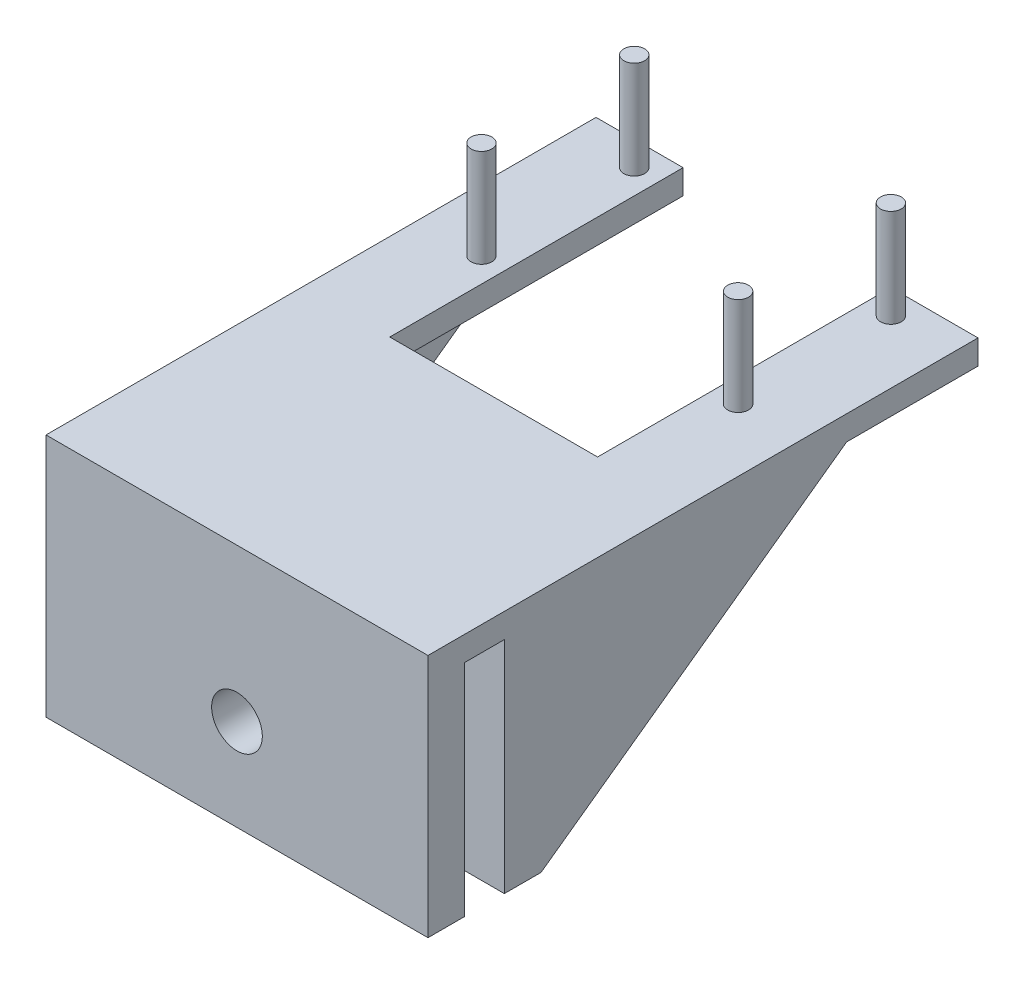
ISO-10303-21;
HEADER;
FILE_DESCRIPTION(('STEP AP214'),'2;1');
FILE_NAME('part.step','',(''),(''),'','','');
FILE_SCHEMA(('AUTOMOTIVE_DESIGN { 1 0 10303 214 1 1 1 1 }'));
ENDSEC;
DATA;
#1=APPLICATION_CONTEXT('core data for automotive mechanical design processes');
#2=APPLICATION_PROTOCOL_DEFINITION('international standard','automotive_design',2000,#1);
#3=PRODUCT_CONTEXT('',#1,'mechanical');
#4=PRODUCT('Part','Part','',(#3));
#5=PRODUCT_RELATED_PRODUCT_CATEGORY('part','',(#4));
#6=PRODUCT_DEFINITION_FORMATION('','',#4);
#7=PRODUCT_DEFINITION_CONTEXT('part definition',#1,'design');
#8=PRODUCT_DEFINITION('design','',#6,#7);
#9=PRODUCT_DEFINITION_SHAPE('','',#8);
#10=(LENGTH_UNIT() NAMED_UNIT(*) SI_UNIT(.MILLI.,.METRE.));
#11=(NAMED_UNIT(*) PLANE_ANGLE_UNIT() SI_UNIT($,.RADIAN.));
#12=(NAMED_UNIT(*) SI_UNIT($,.STERADIAN.) SOLID_ANGLE_UNIT());
#13=UNCERTAINTY_MEASURE_WITH_UNIT(LENGTH_MEASURE(1.E-05),#10,'distance_accuracy_value','');
#14=(GEOMETRIC_REPRESENTATION_CONTEXT(3) GLOBAL_UNCERTAINTY_ASSIGNED_CONTEXT((#13)) GLOBAL_UNIT_ASSIGNED_CONTEXT((#10,
#11,#12)) REPRESENTATION_CONTEXT('',''));
#15=CARTESIAN_POINT('',(0.,0.,0.));
#16=DIRECTION('',(0.,0.,1.));
#17=DIRECTION('',(1.,0.,0.));
#18=AXIS2_PLACEMENT_3D('',#15,#16,#17);
#19=CARTESIAN_POINT('',(31.25,-18.,-9.24999999999999));
#20=DIRECTION('',(0.,0.,1.));
#21=DIRECTION('',(1.,0.,0.));
#22=AXIS2_PLACEMENT_3D('',#19,#20,#21);
#23=PLANE('',#22);
#24=CARTESIAN_POINT('',(15.625,-10.5,-9.24999999999999));
#25=DIRECTION('',(0.,0.,1.));
#26=DIRECTION('',(1.,0.,0.));
#27=AXIS2_PLACEMENT_3D('',#24,#25,#26);
#28=CIRCLE('',#27,2.07500000000001);
#29=CARTESIAN_POINT('',(17.7,-10.5,-9.24999999999999));
#30=VERTEX_POINT('',#29);
#31=EDGE_CURVE('E194',#30,#30,#28,.T.);
#32=ORIENTED_EDGE('',*,*,#31,.T.);
#33=EDGE_LOOP('',(#32));
#34=FACE_BOUND('',#33,.T.);
#35=DIRECTION('',(0.,1.,0.));
#36=VECTOR('',#35,1.);
#37=CARTESIAN_POINT('',(27.25,-18.,-9.24999999999999));
#38=LINE('',#37,#36);
#39=CARTESIAN_POINT('',(27.25,-18.,-9.25));
#40=VERTEX_POINT('',#39);
#41=CARTESIAN_POINT('',(27.25,0.,-9.24999999999999));
#42=VERTEX_POINT('',#41);
#43=EDGE_CURVE('E159',#40,#42,#38,.T.);
#44=ORIENTED_EDGE('',*,*,#43,.F.);
#45=DIRECTION('',(1.,0.,0.));
#46=VECTOR('',#45,1.);
#47=CARTESIAN_POINT('',(31.25,-18.,-9.24999999999999));
#48=LINE('',#47,#46);
#49=CARTESIAN_POINT('',(4.,-18.,-9.25));
#50=VERTEX_POINT('',#49);
#51=EDGE_CURVE('E209',#50,#40,#48,.T.);
#52=ORIENTED_EDGE('',*,*,#51,.F.);
#53=DIRECTION('',(0.,1.,0.));
#54=VECTOR('',#53,1.);
#55=CARTESIAN_POINT('',(4.,-18.,-9.25));
#56=LINE('',#55,#54);
#57=CARTESIAN_POINT('',(4.,0.,-9.25));
#58=VERTEX_POINT('',#57);
#59=EDGE_CURVE('E183',#50,#58,#56,.T.);
#60=ORIENTED_EDGE('',*,*,#59,.T.);
#61=DIRECTION('',(1.,0.,0.));
#62=VECTOR('',#61,1.);
#63=CARTESIAN_POINT('',(31.25,0.,-9.24999999999999));
#64=LINE('',#63,#62);
#65=EDGE_CURVE('E200',#58,#42,#64,.T.);
#66=ORIENTED_EDGE('',*,*,#65,.T.);
#67=EDGE_LOOP('',(#44,#52,#60,#66));
#68=FACE_BOUND('',#67,.T.);
#69=ADVANCED_FACE('F33',(#34,#68),#23,.F.);
#70=CARTESIAN_POINT('',(0.,0.,0.));
#71=DIRECTION('',(0.,-1.,0.));
#72=DIRECTION('',(0.,0.,-1.));
#73=AXIS2_PLACEMENT_3D('',#70,#71,#72);
#74=PLANE('',#73);
#75=DIRECTION('',(-1.,0.,0.));
#76=VECTOR('',#75,1.);
#77=CARTESIAN_POINT('',(0.,0.,-34.25));
#78=LINE('',#77,#76);
#79=CARTESIAN_POINT('',(27.25,0.,-34.25));
#80=VERTEX_POINT('',#79);
#81=CARTESIAN_POINT('',(31.25,0.,-34.25));
#82=VERTEX_POINT('',#81);
#83=EDGE_CURVE('E164',#80,#82,#78,.F.);
#84=ORIENTED_EDGE('',*,*,#83,.F.);
#85=DIRECTION('',(0.,0.,1.));
#86=VECTOR('',#85,1.);
#87=CARTESIAN_POINT('',(27.25,0.,0.));
#88=LINE('',#87,#86);
#89=EDGE_CURVE('E154',#80,#42,#88,.T.);
#90=ORIENTED_EDGE('',*,*,#89,.T.);
#91=ORIENTED_EDGE('',*,*,#65,.F.);
#92=DIRECTION('',(0.,0.,1.));
#93=VECTOR('',#92,1.);
#94=CARTESIAN_POINT('',(4.,0.,0.));
#95=LINE('',#94,#93);
#96=CARTESIAN_POINT('',(4.,0.,-34.25));
#97=VERTEX_POINT('',#96);
#98=EDGE_CURVE('E187',#97,#58,#95,.T.);
#99=ORIENTED_EDGE('',*,*,#98,.F.);
#100=DIRECTION('',(-1.,0.,0.));
#101=VECTOR('',#100,1.);
#102=CARTESIAN_POINT('',(0.,0.,-34.25));
#103=LINE('',#102,#101);
#104=CARTESIAN_POINT('',(0.,0.,-34.25));
#105=VERTEX_POINT('',#104);
#106=EDGE_CURVE('E189',#105,#97,#103,.F.);
#107=ORIENTED_EDGE('',*,*,#106,.F.);
#108=DIRECTION('',(0.,0.,1.));
#109=VECTOR('',#108,1.);
#110=CARTESIAN_POINT('',(0.,0.,0.));
#111=LINE('',#110,#109);
#112=CARTESIAN_POINT('',(0.,0.,-45.));
#113=VERTEX_POINT('',#112);
#114=EDGE_CURVE('E252',#113,#105,#111,.T.);
#115=ORIENTED_EDGE('',*,*,#114,.F.);
#116=DIRECTION('',(-1.,0.,0.));
#117=VECTOR('',#116,1.);
#118=CARTESIAN_POINT('',(0.,0.,-45.));
#119=LINE('',#118,#117);
#120=CARTESIAN_POINT('',(7.125,0.,-45.));
#121=VERTEX_POINT('',#120);
#122=EDGE_CURVE('E278',#121,#113,#119,.T.);
#123=ORIENTED_EDGE('',*,*,#122,.F.);
#124=DIRECTION('',(0.,0.,-1.));
#125=VECTOR('',#124,1.);
#126=CARTESIAN_POINT('',(7.125,0.,-45.));
#127=LINE('',#126,#125);
#128=CARTESIAN_POINT('',(7.125,0.,-21.));
#129=VERTEX_POINT('',#128);
#130=EDGE_CURVE('E276',#129,#121,#127,.T.);
#131=ORIENTED_EDGE('',*,*,#130,.F.);
#132=DIRECTION('',(-1.,0.,0.));
#133=VECTOR('',#132,1.);
#134=CARTESIAN_POINT('',(7.125,0.,-21.));
#135=LINE('',#134,#133);
#136=CARTESIAN_POINT('',(24.125,0.,-21.));
#137=VERTEX_POINT('',#136);
#138=EDGE_CURVE('E274',#137,#129,#135,.T.);
#139=ORIENTED_EDGE('',*,*,#138,.F.);
#140=DIRECTION('',(0.,0.,1.));
#141=VECTOR('',#140,1.);
#142=CARTESIAN_POINT('',(24.125,0.,-21.));
#143=LINE('',#142,#141);
#144=CARTESIAN_POINT('',(24.125,0.,-45.));
#145=VERTEX_POINT('',#144);
#146=EDGE_CURVE('E272',#145,#137,#143,.T.);
#147=ORIENTED_EDGE('',*,*,#146,.F.);
#148=DIRECTION('',(-1.,0.,0.));
#149=VECTOR('',#148,1.);
#150=CARTESIAN_POINT('',(24.125,0.,-45.));
#151=LINE('',#150,#149);
#152=CARTESIAN_POINT('',(31.25,0.,-45.));
#153=VERTEX_POINT('',#152);
#154=EDGE_CURVE('E270',#153,#145,#151,.T.);
#155=ORIENTED_EDGE('',*,*,#154,.F.);
#156=DIRECTION('',(0.,0.,-1.));
#157=VECTOR('',#156,1.);
#158=CARTESIAN_POINT('',(31.25,0.,-45.));
#159=LINE('',#158,#157);
#160=EDGE_CURVE('E176',#82,#153,#159,.T.);
#161=ORIENTED_EDGE('',*,*,#160,.F.);
#162=EDGE_LOOP('',(#84,#90,#91,#99,#107,#115,#123,#131,#139,#147,#155,#161));
#163=FACE_BOUND('',#162,.T.);
#164=ADVANCED_FACE('F174',(#163),#74,.T.);
#165=CARTESIAN_POINT('',(31.25,0.,-3.));
#166=VERTEX_POINT('',#165);
#167=CARTESIAN_POINT('',(31.25,0.,-6.25000000000001));
#168=VERTEX_POINT('',#167);
#169=EDGE_CURVE('E267',#166,#168,#159,.T.);
#170=ORIENTED_EDGE('',*,*,#169,.F.);
#171=DIRECTION('',(1.,0.,0.));
#172=VECTOR('',#171,1.);
#173=CARTESIAN_POINT('',(31.25,0.,-3.));
#174=LINE('',#173,#172);
#175=CARTESIAN_POINT('',(0.,0.,-3.));
#176=VERTEX_POINT('',#175);
#177=EDGE_CURVE('E219',#176,#166,#174,.T.);
#178=ORIENTED_EDGE('',*,*,#177,.F.);
#179=CARTESIAN_POINT('',(0.,0.,-6.25));
#180=VERTEX_POINT('',#179);
#181=EDGE_CURVE('E280',#180,#176,#111,.T.);
#182=ORIENTED_EDGE('',*,*,#181,.F.);
#183=DIRECTION('',(-1.,0.,0.));
#184=VECTOR('',#183,1.);
#185=CARTESIAN_POINT('',(0.,0.,-6.25));
#186=LINE('',#185,#184);
#187=EDGE_CURVE('E204',#168,#180,#186,.T.);
#188=ORIENTED_EDGE('',*,*,#187,.F.);
#189=EDGE_LOOP('',(#170,#178,#182,#188));
#190=FACE_BOUND('',#189,.T.);
#191=ADVANCED_FACE('F344',(#190),#74,.T.);
#192=CARTESIAN_POINT('',(31.25,2.,0.));
#193=DIRECTION('',(0.,0.,-1.));
#194=DIRECTION('',(-1.,0.,0.));
#195=AXIS2_PLACEMENT_3D('',#192,#193,#194);
#196=PLANE('',#195);
#197=DIRECTION('',(0.,-1.,0.));
#198=VECTOR('',#197,1.);
#199=CARTESIAN_POINT('',(31.25,2.,0.));
#200=LINE('',#199,#198);
#201=CARTESIAN_POINT('',(31.25,2.,0.));
#202=VERTEX_POINT('',#201);
#203=CARTESIAN_POINT('',(31.25,-18.,0.));
#204=VERTEX_POINT('',#203);
#205=EDGE_CURVE('E303',#202,#204,#200,.T.);
#206=ORIENTED_EDGE('',*,*,#205,.F.);
#207=DIRECTION('',(1.,0.,0.));
#208=VECTOR('',#207,1.);
#209=CARTESIAN_POINT('',(31.25,2.,0.));
#210=LINE('',#209,#208);
#211=CARTESIAN_POINT('',(0.,2.,0.));
#212=VERTEX_POINT('',#211);
#213=EDGE_CURVE('E249',#212,#202,#210,.T.);
#214=ORIENTED_EDGE('',*,*,#213,.F.);
#215=DIRECTION('',(0.,-1.,0.));
#216=VECTOR('',#215,1.);
#217=CARTESIAN_POINT('',(0.,2.,0.));
#218=LINE('',#217,#216);
#219=CARTESIAN_POINT('',(0.,-18.,0.));
#220=VERTEX_POINT('',#219);
#221=EDGE_CURVE('E266',#212,#220,#218,.T.);
#222=ORIENTED_EDGE('',*,*,#221,.T.);
#223=DIRECTION('',(-1.,0.,0.));
#224=VECTOR('',#223,1.);
#225=CARTESIAN_POINT('',(0.,-18.,0.));
#226=LINE('',#225,#224);
#227=EDGE_CURVE('E228',#204,#220,#226,.T.);
#228=ORIENTED_EDGE('',*,*,#227,.F.);
#229=EDGE_LOOP('',(#206,#214,#222,#228));
#230=FACE_BOUND('',#229,.T.);
#231=CARTESIAN_POINT('',(15.625,-10.5,0.));
#232=DIRECTION('',(0.,0.,1.));
#233=DIRECTION('',(1.,0.,0.));
#234=AXIS2_PLACEMENT_3D('',#231,#232,#233);
#235=CIRCLE('',#234,2.07500000000001);
#236=CARTESIAN_POINT('',(17.7,-10.5,0.));
#237=VERTEX_POINT('',#236);
#238=EDGE_CURVE('E191',#237,#237,#235,.T.);
#239=ORIENTED_EDGE('',*,*,#238,.F.);
#240=EDGE_LOOP('',(#239));
#241=FACE_BOUND('',#240,.T.);
#242=ADVANCED_FACE('F35',(#230,#241),#196,.F.);
#243=CARTESIAN_POINT('',(31.25,2.,-45.));
#244=DIRECTION('',(-1.,0.,0.));
#245=DIRECTION('',(0.,0.,1.));
#246=AXIS2_PLACEMENT_3D('',#243,#244,#245);
#247=PLANE('',#246);
#248=DIRECTION('',(0.,-0.584304725845076,0.811534341451494));
#249=VECTOR('',#248,1.);
#250=CARTESIAN_POINT('',(31.25,0.,-34.25));
#251=LINE('',#250,#249);
#252=CARTESIAN_POINT('',(31.25,-18.,-9.24999999999999));
#253=VERTEX_POINT('',#252);
#254=EDGE_CURVE('E171',#82,#253,#251,.T.);
#255=ORIENTED_EDGE('',*,*,#254,.F.);
#256=ORIENTED_EDGE('',*,*,#160,.T.);
#257=DIRECTION('',(0.,-1.,0.));
#258=VECTOR('',#257,1.);
#259=CARTESIAN_POINT('',(31.25,2.,-45.));
#260=LINE('',#259,#258);
#261=CARTESIAN_POINT('',(31.25,2.,-45.));
#262=VERTEX_POINT('',#261);
#263=EDGE_CURVE('E300',#262,#153,#260,.T.);
#264=ORIENTED_EDGE('',*,*,#263,.F.);
#265=DIRECTION('',(0.,0.,-1.));
#266=VECTOR('',#265,1.);
#267=CARTESIAN_POINT('',(31.25,2.,-45.));
#268=LINE('',#267,#266);
#269=EDGE_CURVE('E251',#202,#262,#268,.T.);
#270=ORIENTED_EDGE('',*,*,#269,.F.);
#271=ORIENTED_EDGE('',*,*,#205,.T.);
#272=DIRECTION('',(0.,0.,1.));
#273=VECTOR('',#272,1.);
#274=CARTESIAN_POINT('',(31.25,-18.,0.));
#275=LINE('',#274,#273);
#276=CARTESIAN_POINT('',(31.25,-18.,-3.));
#277=VERTEX_POINT('',#276);
#278=EDGE_CURVE('E225',#277,#204,#275,.T.);
#279=ORIENTED_EDGE('',*,*,#278,.F.);
#280=DIRECTION('',(0.,1.,0.));
#281=VECTOR('',#280,1.);
#282=CARTESIAN_POINT('',(31.25,-18.,-3.));
#283=LINE('',#282,#281);
#284=EDGE_CURVE('E230',#277,#166,#283,.T.);
#285=ORIENTED_EDGE('',*,*,#284,.T.);
#286=ORIENTED_EDGE('',*,*,#169,.T.);
#287=DIRECTION('',(0.,1.,0.));
#288=VECTOR('',#287,1.);
#289=CARTESIAN_POINT('',(31.25,-18.,-6.25));
#290=LINE('',#289,#288);
#291=CARTESIAN_POINT('',(31.25,-18.,-6.25));
#292=VERTEX_POINT('',#291);
#293=EDGE_CURVE('E57',#292,#168,#290,.T.);
#294=ORIENTED_EDGE('',*,*,#293,.F.);
#295=DIRECTION('',(0.,0.,1.));
#296=VECTOR('',#295,1.);
#297=CARTESIAN_POINT('',(31.25,-18.,-6.25));
#298=LINE('',#297,#296);
#299=EDGE_CURVE('E208',#253,#292,#298,.T.);
#300=ORIENTED_EDGE('',*,*,#299,.F.);
#301=EDGE_LOOP('',(#255,#256,#264,#270,#271,#279,#285,#286,#294,#300));
#302=FACE_BOUND('',#301,.T.);
#303=ADVANCED_FACE('F477',(#302),#247,.F.);
#304=CARTESIAN_POINT('',(24.125,2.,-45.));
#305=DIRECTION('',(0.,0.,1.));
#306=DIRECTION('',(1.,0.,0.));
#307=AXIS2_PLACEMENT_3D('',#304,#305,#306);
#308=PLANE('',#307);
#309=ORIENTED_EDGE('',*,*,#154,.T.);
#310=DIRECTION('',(0.,-1.,0.));
#311=VECTOR('',#310,1.);
#312=CARTESIAN_POINT('',(24.125,2.,-45.));
#313=LINE('',#312,#311);
#314=CARTESIAN_POINT('',(24.125,2.,-45.));
#315=VERTEX_POINT('',#314);
#316=EDGE_CURVE('E297',#315,#145,#313,.T.);
#317=ORIENTED_EDGE('',*,*,#316,.F.);
#318=DIRECTION('',(-1.,0.,0.));
#319=VECTOR('',#318,1.);
#320=CARTESIAN_POINT('',(24.125,2.,-45.));
#321=LINE('',#320,#319);
#322=EDGE_CURVE('E254',#262,#315,#321,.T.);
#323=ORIENTED_EDGE('',*,*,#322,.F.);
#324=ORIENTED_EDGE('',*,*,#263,.T.);
#325=EDGE_LOOP('',(#309,#317,#323,#324));
#326=FACE_BOUND('',#325,.T.);
#327=ADVANCED_FACE('F484',(#326),#308,.F.);
#328=CARTESIAN_POINT('',(24.125,2.,-21.));
#329=DIRECTION('',(1.,0.,0.));
#330=DIRECTION('',(0.,0.,-1.));
#331=AXIS2_PLACEMENT_3D('',#328,#329,#330);
#332=PLANE('',#331);
#333=ORIENTED_EDGE('',*,*,#146,.T.);
#334=DIRECTION('',(0.,-1.,0.));
#335=VECTOR('',#334,1.);
#336=CARTESIAN_POINT('',(24.125,2.,-21.));
#337=LINE('',#336,#335);
#338=CARTESIAN_POINT('',(24.125,2.,-21.));
#339=VERTEX_POINT('',#338);
#340=EDGE_CURVE('E294',#339,#137,#337,.T.);
#341=ORIENTED_EDGE('',*,*,#340,.F.);
#342=DIRECTION('',(0.,0.,1.));
#343=VECTOR('',#342,1.);
#344=CARTESIAN_POINT('',(24.125,2.,-21.));
#345=LINE('',#344,#343);
#346=EDGE_CURVE('E256',#315,#339,#345,.T.);
#347=ORIENTED_EDGE('',*,*,#346,.F.);
#348=ORIENTED_EDGE('',*,*,#316,.T.);
#349=EDGE_LOOP('',(#333,#341,#347,#348));
#350=FACE_BOUND('',#349,.T.);
#351=ADVANCED_FACE('F588',(#350),#332,.F.);
#352=CARTESIAN_POINT('',(7.125,2.,-21.));
#353=DIRECTION('',(0.,0.,1.));
#354=DIRECTION('',(1.,0.,0.));
#355=AXIS2_PLACEMENT_3D('',#352,#353,#354);
#356=PLANE('',#355);
#357=ORIENTED_EDGE('',*,*,#138,.T.);
#358=DIRECTION('',(0.,-1.,0.));
#359=VECTOR('',#358,1.);
#360=CARTESIAN_POINT('',(7.125,2.,-21.));
#361=LINE('',#360,#359);
#362=CARTESIAN_POINT('',(7.125,2.,-21.));
#363=VERTEX_POINT('',#362);
#364=EDGE_CURVE('E291',#363,#129,#361,.T.);
#365=ORIENTED_EDGE('',*,*,#364,.F.);
#366=DIRECTION('',(-1.,0.,0.));
#367=VECTOR('',#366,1.);
#368=CARTESIAN_POINT('',(7.125,2.,-21.));
#369=LINE('',#368,#367);
#370=EDGE_CURVE('E258',#339,#363,#369,.T.);
#371=ORIENTED_EDGE('',*,*,#370,.F.);
#372=ORIENTED_EDGE('',*,*,#340,.T.);
#373=EDGE_LOOP('',(#357,#365,#371,#372));
#374=FACE_BOUND('',#373,.T.);
#375=ADVANCED_FACE('F597',(#374),#356,.F.);
#376=CARTESIAN_POINT('',(7.125,2.,-45.));
#377=DIRECTION('',(-1.,0.,0.));
#378=DIRECTION('',(0.,0.,1.));
#379=AXIS2_PLACEMENT_3D('',#376,#377,#378);
#380=PLANE('',#379);
#381=ORIENTED_EDGE('',*,*,#130,.T.);
#382=DIRECTION('',(0.,-1.,0.));
#383=VECTOR('',#382,1.);
#384=CARTESIAN_POINT('',(7.125,2.,-45.));
#385=LINE('',#384,#383);
#386=CARTESIAN_POINT('',(7.125,2.,-45.));
#387=VERTEX_POINT('',#386);
#388=EDGE_CURVE('E288',#387,#121,#385,.T.);
#389=ORIENTED_EDGE('',*,*,#388,.F.);
#390=DIRECTION('',(0.,0.,-1.));
#391=VECTOR('',#390,1.);
#392=CARTESIAN_POINT('',(7.125,2.,-45.));
#393=LINE('',#392,#391);
#394=EDGE_CURVE('E260',#363,#387,#393,.T.);
#395=ORIENTED_EDGE('',*,*,#394,.F.);
#396=ORIENTED_EDGE('',*,*,#364,.T.);
#397=EDGE_LOOP('',(#381,#389,#395,#396));
#398=FACE_BOUND('',#397,.T.);
#399=ADVANCED_FACE('F606',(#398),#380,.F.);
#400=CARTESIAN_POINT('',(0.,2.,-45.));
#401=DIRECTION('',(0.,0.,1.));
#402=DIRECTION('',(1.,0.,0.));
#403=AXIS2_PLACEMENT_3D('',#400,#401,#402);
#404=PLANE('',#403);
#405=ORIENTED_EDGE('',*,*,#122,.T.);
#406=DIRECTION('',(0.,-1.,0.));
#407=VECTOR('',#406,1.);
#408=CARTESIAN_POINT('',(0.,2.,-45.));
#409=LINE('',#408,#407);
#410=CARTESIAN_POINT('',(0.,2.,-45.));
#411=VERTEX_POINT('',#410);
#412=EDGE_CURVE('E285',#411,#113,#409,.T.);
#413=ORIENTED_EDGE('',*,*,#412,.F.);
#414=DIRECTION('',(-1.,0.,0.));
#415=VECTOR('',#414,1.);
#416=CARTESIAN_POINT('',(0.,2.,-45.));
#417=LINE('',#416,#415);
#418=EDGE_CURVE('E262',#387,#411,#417,.T.);
#419=ORIENTED_EDGE('',*,*,#418,.F.);
#420=ORIENTED_EDGE('',*,*,#388,.T.);
#421=EDGE_LOOP('',(#405,#413,#419,#420));
#422=FACE_BOUND('',#421,.T.);
#423=ADVANCED_FACE('F505',(#422),#404,.F.);
#424=CARTESIAN_POINT('',(0.,2.,0.));
#425=DIRECTION('',(1.,0.,0.));
#426=DIRECTION('',(0.,0.,-1.));
#427=AXIS2_PLACEMENT_3D('',#424,#425,#426);
#428=PLANE('',#427);
#429=ORIENTED_EDGE('',*,*,#221,.F.);
#430=DIRECTION('',(0.,0.,1.));
#431=VECTOR('',#430,1.);
#432=CARTESIAN_POINT('',(0.,2.,0.));
#433=LINE('',#432,#431);
#434=EDGE_CURVE('E264',#411,#212,#433,.T.);
#435=ORIENTED_EDGE('',*,*,#434,.F.);
#436=ORIENTED_EDGE('',*,*,#412,.T.);
#437=ORIENTED_EDGE('',*,*,#114,.T.);
#438=DIRECTION('',(0.,-0.584304725845076,0.811534341451494));
#439=VECTOR('',#438,1.);
#440=CARTESIAN_POINT('',(0.,0.,-34.25));
#441=LINE('',#440,#439);
#442=CARTESIAN_POINT('',(0.,-18.,-9.25));
#443=VERTEX_POINT('',#442);
#444=EDGE_CURVE('E177',#105,#443,#441,.T.);
#445=ORIENTED_EDGE('',*,*,#444,.T.);
#446=DIRECTION('',(0.,0.,-1.));
#447=VECTOR('',#446,1.);
#448=CARTESIAN_POINT('',(0.,-18.,-9.25));
#449=LINE('',#448,#447);
#450=CARTESIAN_POINT('',(0.,-18.,-6.25));
#451=VERTEX_POINT('',#450);
#452=EDGE_CURVE('E201',#451,#443,#449,.T.);
#453=ORIENTED_EDGE('',*,*,#452,.F.);
#454=DIRECTION('',(0.,1.,0.));
#455=VECTOR('',#454,1.);
#456=CARTESIAN_POINT('',(0.,-18.,-6.25));
#457=LINE('',#456,#455);
#458=EDGE_CURVE('E213',#451,#180,#457,.T.);
#459=ORIENTED_EDGE('',*,*,#458,.T.);
#460=ORIENTED_EDGE('',*,*,#181,.T.);
#461=DIRECTION('',(0.,1.,0.));
#462=VECTOR('',#461,1.);
#463=CARTESIAN_POINT('',(0.,-18.,-3.));
#464=LINE('',#463,#462);
#465=CARTESIAN_POINT('',(0.,-18.,-3.));
#466=VERTEX_POINT('',#465);
#467=EDGE_CURVE('E234',#466,#176,#464,.T.);
#468=ORIENTED_EDGE('',*,*,#467,.F.);
#469=DIRECTION('',(0.,0.,-1.));
#470=VECTOR('',#469,1.);
#471=CARTESIAN_POINT('',(0.,-18.,-3.));
#472=LINE('',#471,#470);
#473=EDGE_CURVE('E220',#220,#466,#472,.T.);
#474=ORIENTED_EDGE('',*,*,#473,.F.);
#475=EDGE_LOOP('',(#429,#435,#436,#437,#445,#453,#459,#460,#468,#474));
#476=FACE_BOUND('',#475,.T.);
#477=ADVANCED_FACE('F320',(#476),#428,.F.);
#478=CARTESIAN_POINT('',(0.,2.,0.));
#479=DIRECTION('',(0.,-1.,0.));
#480=DIRECTION('',(0.,0.,-1.));
#481=AXIS2_PLACEMENT_3D('',#478,#479,#480);
#482=PLANE('',#481);
#483=ORIENTED_EDGE('',*,*,#269,.T.);
#484=ORIENTED_EDGE('',*,*,#322,.T.);
#485=ORIENTED_EDGE('',*,*,#346,.T.);
#486=ORIENTED_EDGE('',*,*,#370,.T.);
#487=ORIENTED_EDGE('',*,*,#394,.T.);
#488=ORIENTED_EDGE('',*,*,#418,.T.);
#489=ORIENTED_EDGE('',*,*,#434,.T.);
#490=ORIENTED_EDGE('',*,*,#213,.T.);
#491=EDGE_LOOP('',(#483,#484,#485,#486,#487,#488,#489,#490));
#492=FACE_BOUND('',#491,.T.);
#493=CARTESIAN_POINT('',(26.125,2.,-43.));
#494=DIRECTION('',(0.,-1.,0.));
#495=DIRECTION('',(0.,0.,-1.));
#496=AXIS2_PLACEMENT_3D('',#493,#494,#495);
#497=CIRCLE('',#496,0.850000000000001);
#498=CARTESIAN_POINT('',(26.125,2.,-43.85));
#499=VERTEX_POINT('',#498);
#500=EDGE_CURVE('E11',#499,#499,#497,.F.);
#501=ORIENTED_EDGE('',*,*,#500,.F.);
#502=EDGE_LOOP('',(#501));
#503=FACE_BOUND('',#502,.T.);
#504=CARTESIAN_POINT('',(26.125,2.,-30.5));
#505=DIRECTION('',(0.,-1.,0.));
#506=DIRECTION('',(0.,0.,-1.));
#507=AXIS2_PLACEMENT_3D('',#504,#505,#506);
#508=CIRCLE('',#507,0.85);
#509=CARTESIAN_POINT('',(26.125,2.,-31.35));
#510=VERTEX_POINT('',#509);
#511=EDGE_CURVE('E42',#510,#510,#508,.F.);
#512=ORIENTED_EDGE('',*,*,#511,.F.);
#513=EDGE_LOOP('',(#512));
#514=FACE_BOUND('',#513,.T.);
#515=CARTESIAN_POINT('',(5.125,2.,-30.5));
#516=DIRECTION('',(0.,-1.,0.));
#517=DIRECTION('',(0.,0.,-1.));
#518=AXIS2_PLACEMENT_3D('',#515,#516,#517);
#519=CIRCLE('',#518,0.85);
#520=CARTESIAN_POINT('',(5.125,2.,-31.35));
#521=VERTEX_POINT('',#520);
#522=EDGE_CURVE('E308',#521,#521,#519,.F.);
#523=ORIENTED_EDGE('',*,*,#522,.F.);
#524=EDGE_LOOP('',(#523));
#525=FACE_BOUND('',#524,.T.);
#526=CARTESIAN_POINT('',(5.125,2.,-43.));
#527=DIRECTION('',(0.,-1.,0.));
#528=DIRECTION('',(0.,0.,-1.));
#529=AXIS2_PLACEMENT_3D('',#526,#527,#528);
#530=CIRCLE('',#529,0.850000000000001);
#531=CARTESIAN_POINT('',(5.125,2.,-43.85));
#532=VERTEX_POINT('',#531);
#533=EDGE_CURVE('E305',#532,#532,#530,.F.);
#534=ORIENTED_EDGE('',*,*,#533,.F.);
#535=EDGE_LOOP('',(#534));
#536=FACE_BOUND('',#535,.T.);
#537=ADVANCED_FACE('F316',(#492,#503,#514,#525,#536),#482,.F.);
#538=CARTESIAN_POINT('',(5.125,10.,-43.));
#539=DIRECTION('',(0.,-1.,0.));
#540=DIRECTION('',(0.,0.,-1.));
#541=AXIS2_PLACEMENT_3D('',#538,#539,#540);
#542=CYLINDRICAL_SURFACE('',#541,0.850000000000001);
#543=CARTESIAN_POINT('',(5.125,10.,-43.));
#544=DIRECTION('',(0.,1.,0.));
#545=DIRECTION('',(0.,0.,1.));
#546=AXIS2_PLACEMENT_3D('',#543,#544,#545);
#547=CIRCLE('',#546,0.850000000000001);
#548=CARTESIAN_POINT('',(5.125,10.,-42.15));
#549=VERTEX_POINT('',#548);
#550=EDGE_CURVE('E246',#549,#549,#547,.T.);
#551=ORIENTED_EDGE('',*,*,#550,.F.);
#552=EDGE_LOOP('',(#551));
#553=FACE_BOUND('',#552,.T.);
#554=ORIENTED_EDGE('',*,*,#533,.T.);
#555=EDGE_LOOP('',(#554));
#556=FACE_BOUND('',#555,.T.);
#557=ADVANCED_FACE('F319',(#553,#556),#542,.T.);
#558=CARTESIAN_POINT('',(5.125,10.,-43.));
#559=DIRECTION('',(0.,1.,0.));
#560=DIRECTION('',(0.,0.,1.));
#561=AXIS2_PLACEMENT_3D('',#558,#559,#560);
#562=PLANE('',#561);
#563=ORIENTED_EDGE('',*,*,#550,.T.);
#564=EDGE_LOOP('',(#563));
#565=FACE_BOUND('',#564,.T.);
#566=ADVANCED_FACE('F328',(#565),#562,.T.);
#567=CARTESIAN_POINT('',(5.125,10.,-30.5));
#568=DIRECTION('',(0.,-1.,0.));
#569=DIRECTION('',(0.,0.,-1.));
#570=AXIS2_PLACEMENT_3D('',#567,#568,#569);
#571=CYLINDRICAL_SURFACE('',#570,0.85);
#572=CARTESIAN_POINT('',(5.125,10.,-30.5));
#573=DIRECTION('',(0.,1.,0.));
#574=DIRECTION('',(0.,0.,1.));
#575=AXIS2_PLACEMENT_3D('',#572,#573,#574);
#576=CIRCLE('',#575,0.85);
#577=CARTESIAN_POINT('',(5.125,10.,-29.65));
#578=VERTEX_POINT('',#577);
#579=EDGE_CURVE('E243',#578,#578,#576,.T.);
#580=ORIENTED_EDGE('',*,*,#579,.F.);
#581=EDGE_LOOP('',(#580));
#582=FACE_BOUND('',#581,.T.);
#583=ORIENTED_EDGE('',*,*,#522,.T.);
#584=EDGE_LOOP('',(#583));
#585=FACE_BOUND('',#584,.T.);
#586=ADVANCED_FACE('F334',(#582,#585),#571,.T.);
#587=CARTESIAN_POINT('',(5.125,10.,-30.5));
#588=DIRECTION('',(0.,1.,0.));
#589=DIRECTION('',(0.,0.,1.));
#590=AXIS2_PLACEMENT_3D('',#587,#588,#589);
#591=PLANE('',#590);
#592=ORIENTED_EDGE('',*,*,#579,.T.);
#593=EDGE_LOOP('',(#592));
#594=FACE_BOUND('',#593,.T.);
#595=ADVANCED_FACE('F373',(#594),#591,.T.);
#596=CARTESIAN_POINT('',(26.125,10.,-30.5));
#597=DIRECTION('',(0.,-1.,0.));
#598=DIRECTION('',(0.,0.,-1.));
#599=AXIS2_PLACEMENT_3D('',#596,#597,#598);
#600=CYLINDRICAL_SURFACE('',#599,0.85);
#601=CARTESIAN_POINT('',(26.125,10.,-30.5));
#602=DIRECTION('',(0.,1.,0.));
#603=DIRECTION('',(0.,0.,1.));
#604=AXIS2_PLACEMENT_3D('',#601,#602,#603);
#605=CIRCLE('',#604,0.85);
#606=CARTESIAN_POINT('',(26.125,10.,-29.65));
#607=VERTEX_POINT('',#606);
#608=EDGE_CURVE('E240',#607,#607,#605,.T.);
#609=ORIENTED_EDGE('',*,*,#608,.F.);
#610=EDGE_LOOP('',(#609));
#611=FACE_BOUND('',#610,.T.);
#612=ORIENTED_EDGE('',*,*,#511,.T.);
#613=EDGE_LOOP('',(#612));
#614=FACE_BOUND('',#613,.T.);
#615=ADVANCED_FACE('F314',(#611,#614),#600,.T.);
#616=CARTESIAN_POINT('',(26.125,10.,-30.5));
#617=DIRECTION('',(0.,1.,0.));
#618=DIRECTION('',(0.,0.,1.));
#619=AXIS2_PLACEMENT_3D('',#616,#617,#618);
#620=PLANE('',#619);
#621=ORIENTED_EDGE('',*,*,#608,.T.);
#622=EDGE_LOOP('',(#621));
#623=FACE_BOUND('',#622,.T.);
#624=ADVANCED_FACE('F366',(#623),#620,.T.);
#625=CARTESIAN_POINT('',(26.125,10.,-43.));
#626=DIRECTION('',(0.,-1.,0.));
#627=DIRECTION('',(0.,0.,-1.));
#628=AXIS2_PLACEMENT_3D('',#625,#626,#627);
#629=CYLINDRICAL_SURFACE('',#628,0.850000000000001);
#630=CARTESIAN_POINT('',(26.125,10.,-43.));
#631=DIRECTION('',(0.,1.,0.));
#632=DIRECTION('',(0.,0.,1.));
#633=AXIS2_PLACEMENT_3D('',#630,#631,#632);
#634=CIRCLE('',#633,0.850000000000001);
#635=CARTESIAN_POINT('',(26.125,10.,-42.15));
#636=VERTEX_POINT('',#635);
#637=EDGE_CURVE('E237',#636,#636,#634,.T.);
#638=ORIENTED_EDGE('',*,*,#637,.F.);
#639=EDGE_LOOP('',(#638));
#640=FACE_BOUND('',#639,.T.);
#641=ORIENTED_EDGE('',*,*,#500,.T.);
#642=EDGE_LOOP('',(#641));
#643=FACE_BOUND('',#642,.T.);
#644=ADVANCED_FACE('F362',(#640,#643),#629,.T.);
#645=CARTESIAN_POINT('',(26.125,10.,-43.));
#646=DIRECTION('',(0.,1.,0.));
#647=DIRECTION('',(0.,0.,1.));
#648=AXIS2_PLACEMENT_3D('',#645,#646,#647);
#649=PLANE('',#648);
#650=ORIENTED_EDGE('',*,*,#637,.T.);
#651=EDGE_LOOP('',(#650));
#652=FACE_BOUND('',#651,.T.);
#653=ADVANCED_FACE('F358',(#652),#649,.T.);
#654=CARTESIAN_POINT('',(31.25,-18.,-3.));
#655=DIRECTION('',(0.,0.,1.));
#656=DIRECTION('',(1.,0.,0.));
#657=AXIS2_PLACEMENT_3D('',#654,#655,#656);
#658=PLANE('',#657);
#659=ORIENTED_EDGE('',*,*,#284,.F.);
#660=DIRECTION('',(1.,0.,0.));
#661=VECTOR('',#660,1.);
#662=CARTESIAN_POINT('',(31.25,-18.,-3.));
#663=LINE('',#662,#661);
#664=EDGE_CURVE('E223',#466,#277,#663,.T.);
#665=ORIENTED_EDGE('',*,*,#664,.F.);
#666=ORIENTED_EDGE('',*,*,#467,.T.);
#667=ORIENTED_EDGE('',*,*,#177,.T.);
#668=EDGE_LOOP('',(#659,#665,#666,#667));
#669=FACE_BOUND('',#668,.T.);
#670=CARTESIAN_POINT('',(15.625,-10.5,-3.));
#671=DIRECTION('',(0.,0.,1.));
#672=DIRECTION('',(1.,0.,0.));
#673=AXIS2_PLACEMENT_3D('',#670,#671,#672);
#674=CIRCLE('',#673,2.07500000000001);
#675=CARTESIAN_POINT('',(17.7,-10.5,-3.));
#676=VERTEX_POINT('',#675);
#677=EDGE_CURVE('E197',#676,#676,#674,.T.);
#678=ORIENTED_EDGE('',*,*,#677,.T.);
#679=EDGE_LOOP('',(#678));
#680=FACE_BOUND('',#679,.T.);
#681=ADVANCED_FACE('F354',(#669,#680),#658,.F.);
#682=CARTESIAN_POINT('',(0.,-18.,0.));
#683=DIRECTION('',(0.,1.,0.));
#684=DIRECTION('',(0.,0.,1.));
#685=AXIS2_PLACEMENT_3D('',#682,#683,#684);
#686=PLANE('',#685);
#687=ORIENTED_EDGE('',*,*,#227,.T.);
#688=ORIENTED_EDGE('',*,*,#473,.T.);
#689=ORIENTED_EDGE('',*,*,#664,.T.);
#690=ORIENTED_EDGE('',*,*,#278,.T.);
#691=EDGE_LOOP('',(#687,#688,#689,#690));
#692=FACE_BOUND('',#691,.T.);
#693=ADVANCED_FACE('F351',(#692),#686,.F.);
#694=CARTESIAN_POINT('',(0.,-18.,-6.25));
#695=DIRECTION('',(0.,0.,-1.));
#696=DIRECTION('',(-1.,0.,0.));
#697=AXIS2_PLACEMENT_3D('',#694,#695,#696);
#698=PLANE('',#697);
#699=ORIENTED_EDGE('',*,*,#187,.T.);
#700=ORIENTED_EDGE('',*,*,#458,.F.);
#701=DIRECTION('',(-1.,0.,0.));
#702=VECTOR('',#701,1.);
#703=CARTESIAN_POINT('',(0.,-18.,-6.25));
#704=LINE('',#703,#702);
#705=EDGE_CURVE('E211',#292,#451,#704,.T.);
#706=ORIENTED_EDGE('',*,*,#705,.F.);
#707=ORIENTED_EDGE('',*,*,#293,.T.);
#708=EDGE_LOOP('',(#699,#700,#706,#707));
#709=FACE_BOUND('',#708,.T.);
#710=CARTESIAN_POINT('',(15.625,-10.5,-6.25));
#711=DIRECTION('',(0.,0.,-1.));
#712=DIRECTION('',(-1.,0.,0.));
#713=AXIS2_PLACEMENT_3D('',#710,#711,#712);
#714=CIRCLE('',#713,2.07500000000001);
#715=CARTESIAN_POINT('',(17.7,-10.5,-6.25));
#716=VERTEX_POINT('',#715);
#717=EDGE_CURVE('E37',#716,#716,#714,.T.);
#718=ORIENTED_EDGE('',*,*,#717,.T.);
#719=EDGE_LOOP('',(#718));
#720=FACE_BOUND('',#719,.T.);
#721=ADVANCED_FACE('F349',(#709,#720),#698,.F.);
#722=CARTESIAN_POINT('',(0.,-18.,0.));
#723=DIRECTION('',(0.,1.,0.));
#724=DIRECTION('',(0.,0.,1.));
#725=AXIS2_PLACEMENT_3D('',#722,#723,#724);
#726=PLANE('',#725);
#727=ORIENTED_EDGE('',*,*,#705,.T.);
#728=ORIENTED_EDGE('',*,*,#452,.T.);
#729=EDGE_CURVE('E205',#443,#50,#48,.T.);
#730=ORIENTED_EDGE('',*,*,#729,.T.);
#731=ORIENTED_EDGE('',*,*,#51,.T.);
#732=EDGE_CURVE('E170',#40,#253,#48,.T.);
#733=ORIENTED_EDGE('',*,*,#732,.T.);
#734=ORIENTED_EDGE('',*,*,#299,.T.);
#735=EDGE_LOOP('',(#727,#728,#730,#731,#733,#734));
#736=FACE_BOUND('',#735,.T.);
#737=ADVANCED_FACE('F422',(#736),#726,.F.);
#738=CARTESIAN_POINT('',(15.625,-10.5,-45.));
#739=DIRECTION('',(0.,0.,1.));
#740=DIRECTION('',(1.,0.,0.));
#741=AXIS2_PLACEMENT_3D('',#738,#739,#740);
#742=CYLINDRICAL_SURFACE('',#741,2.07500000000001);
#743=CARTESIAN_POINT('',(17.7,-10.5,-6.25));
#744=CARTESIAN_POINT('',(17.7,-10.5,-6.28125));
#745=CARTESIAN_POINT('',(17.7,-10.5,-6.3125));
#746=CARTESIAN_POINT('',(17.7,-10.5,-6.375));
#747=CARTESIAN_POINT('',(17.7,-10.5,-6.40625));
#748=CARTESIAN_POINT('',(17.7,-10.5,-6.46875));
#749=CARTESIAN_POINT('',(17.7,-10.5,-6.5));
#750=CARTESIAN_POINT('',(17.7,-10.5,-6.5625));
#751=CARTESIAN_POINT('',(17.7,-10.5,-6.59375));
#752=CARTESIAN_POINT('',(17.7,-10.5,-6.65625));
#753=CARTESIAN_POINT('',(17.7,-10.5,-6.6875));
#754=CARTESIAN_POINT('',(17.7,-10.5,-6.75));
#755=CARTESIAN_POINT('',(17.7,-10.5,-6.78125));
#756=CARTESIAN_POINT('',(17.7,-10.5,-6.84375));
#757=CARTESIAN_POINT('',(17.7,-10.5,-6.875));
#758=CARTESIAN_POINT('',(17.7,-10.5,-6.9375));
#759=CARTESIAN_POINT('',(17.7,-10.5,-6.96875));
#760=CARTESIAN_POINT('',(17.7,-10.5,-7.03125));
#761=CARTESIAN_POINT('',(17.7,-10.5,-7.0625));
#762=CARTESIAN_POINT('',(17.7,-10.5,-7.12499999999999));
#763=CARTESIAN_POINT('',(17.7,-10.5,-7.15624999999999));
#764=CARTESIAN_POINT('',(17.7,-10.5,-7.21874999999999));
#765=CARTESIAN_POINT('',(17.7,-10.5,-7.25));
#766=CARTESIAN_POINT('',(17.7,-10.5,-7.3125));
#767=CARTESIAN_POINT('',(17.7,-10.5,-7.34374999999999));
#768=CARTESIAN_POINT('',(17.7,-10.5,-7.40624999999999));
#769=CARTESIAN_POINT('',(17.7,-10.5,-7.4375));
#770=CARTESIAN_POINT('',(17.7,-10.5,-7.5));
#771=CARTESIAN_POINT('',(17.7,-10.5,-7.53124999999999));
#772=CARTESIAN_POINT('',(17.7,-10.5,-7.59374999999999));
#773=CARTESIAN_POINT('',(17.7,-10.5,-7.625));
#774=CARTESIAN_POINT('',(17.7,-10.5,-7.6875));
#775=CARTESIAN_POINT('',(17.7,-10.5,-7.71874999999999));
#776=CARTESIAN_POINT('',(17.7,-10.5,-7.78124999999999));
#777=CARTESIAN_POINT('',(17.7,-10.5,-7.81249999999999));
#778=CARTESIAN_POINT('',(17.7,-10.5,-7.87499999999999));
#779=CARTESIAN_POINT('',(17.7,-10.5,-7.90624999999999));
#780=CARTESIAN_POINT('',(17.7,-10.5,-7.96874999999999));
#781=CARTESIAN_POINT('',(17.7,-10.5,-7.99999999999999));
#782=CARTESIAN_POINT('',(17.7,-10.5,-8.06249999999999));
#783=CARTESIAN_POINT('',(17.7,-10.5,-8.09374999999999));
#784=CARTESIAN_POINT('',(17.7,-10.5,-8.15624999999999));
#785=CARTESIAN_POINT('',(17.7,-10.5,-8.18749999999999));
#786=CARTESIAN_POINT('',(17.7,-10.5,-8.24999999999999));
#787=CARTESIAN_POINT('',(17.7,-10.5,-8.28124999999999));
#788=CARTESIAN_POINT('',(17.7,-10.5,-8.34374999999999));
#789=CARTESIAN_POINT('',(17.7,-10.5,-8.37499999999999));
#790=CARTESIAN_POINT('',(17.7,-10.5,-8.43749999999999));
#791=CARTESIAN_POINT('',(17.7,-10.5,-8.46874999999999));
#792=CARTESIAN_POINT('',(17.7,-10.5,-8.53124999999999));
#793=CARTESIAN_POINT('',(17.7,-10.5,-8.56249999999999));
#794=CARTESIAN_POINT('',(17.7,-10.5,-8.62499999999999));
#795=CARTESIAN_POINT('',(17.7,-10.5,-8.65624999999999));
#796=CARTESIAN_POINT('',(17.7,-10.5,-8.71874999999999));
#797=CARTESIAN_POINT('',(17.7,-10.5,-8.74999999999999));
#798=CARTESIAN_POINT('',(17.7,-10.5,-8.81249999999999));
#799=CARTESIAN_POINT('',(17.7,-10.5,-8.84374999999999));
#800=CARTESIAN_POINT('',(17.7,-10.5,-8.90624999999999));
#801=CARTESIAN_POINT('',(17.7,-10.5,-8.93749999999999));
#802=CARTESIAN_POINT('',(17.7,-10.5,-8.99999999999999));
#803=CARTESIAN_POINT('',(17.7,-10.5,-9.03124999999999));
#804=CARTESIAN_POINT('',(17.7,-10.5,-9.09374999999999));
#805=CARTESIAN_POINT('',(17.7,-10.5,-9.12499999999999));
#806=CARTESIAN_POINT('',(17.7,-10.5,-9.18749999999999));
#807=CARTESIAN_POINT('',(17.7,-10.5,-9.21874999999999));
#808=CARTESIAN_POINT('',(17.7,-10.5,-9.24999999999999));
#809=B_SPLINE_CURVE_WITH_KNOTS('',3,(#743,#744,#745,#746,#747,#748,#749,#750,#751,#752,#753,
#754,#755,#756,#757,#758,#759,#760,#761,#762,#763,#764,#765,#766,#767,#768,#769,#770,#771,#772,
#773,#774,#775,#776,#777,#778,#779,#780,#781,#782,#783,#784,#785,#786,#787,#788,#789,#790,#791,
#792,#793,#794,#795,#796,#797,#798,#799,#800,#801,#802,#803,#804,#805,#806,#807,#808),
.UNSPECIFIED.,.F.,.F.,(4,2,2,2,2,2,2,2,2,2,2,2,2,2,2,2,2,2,2,2,2,2,2,2,2,2,2,2,2,2,2,2,4),(0.,
0.0937499999999966,0.1875,0.281249999999997,0.375,0.468749999999997,0.5625,0.656249999999997,
0.750000000000001,0.843749999999997,0.937499999999994,1.03125,1.12499999999999,1.21875,
1.31249999999999,1.40625,1.49999999999999,1.59374999999999,1.68749999999999,1.78124999999999,
1.87499999999999,1.96874999999999,2.06249999999999,2.15624999999999,2.24999999999999,
2.34374999999999,2.43749999999999,2.53124999999999,2.62499999999999,2.71874999999999,
2.81249999999999,2.90624999999999,2.99999999999999),.UNSPECIFIED.);
#810=EDGE_CURVE('BSEAM428',#716,#30,#809,.T.);
#811=ORIENTED_EDGE('',*,*,#717,.F.);
#812=ORIENTED_EDGE('',*,*,#31,.F.);
#813=ORIENTED_EDGE('',*,*,#810,.T.);
#814=ORIENTED_EDGE('',*,*,#810,.F.);
#815=EDGE_LOOP('',(#811,#813,#812,#814));
#816=FACE_BOUND('',#815,.T.);
#817=ADVANCED_FACE('F428',(#816),#742,.F.);
#818=CARTESIAN_POINT('',(17.7,-10.5,0.));
#819=CARTESIAN_POINT('',(17.7,-10.5,-0.0312500000000058));
#820=CARTESIAN_POINT('',(17.7,-10.5,-0.0625000000000047));
#821=CARTESIAN_POINT('',(17.7,-10.5,-0.125000000000005));
#822=CARTESIAN_POINT('',(17.7,-10.5,-0.156250000000006));
#823=CARTESIAN_POINT('',(17.7,-10.5,-0.218750000000006));
#824=CARTESIAN_POINT('',(17.7,-10.5,-0.250000000000005));
#825=CARTESIAN_POINT('',(17.7,-10.5,-0.312500000000005));
#826=CARTESIAN_POINT('',(17.7,-10.5,-0.343750000000006));
#827=CARTESIAN_POINT('',(17.7,-10.5,-0.406250000000006));
#828=CARTESIAN_POINT('',(17.7,-10.5,-0.437500000000005));
#829=CARTESIAN_POINT('',(17.7,-10.5,-0.500000000000005));
#830=CARTESIAN_POINT('',(17.7,-10.5,-0.531250000000006));
#831=CARTESIAN_POINT('',(17.7,-10.5,-0.593750000000006));
#832=CARTESIAN_POINT('',(17.7,-10.5,-0.625000000000005));
#833=CARTESIAN_POINT('',(17.7,-10.5,-0.687500000000005));
#834=CARTESIAN_POINT('',(17.7,-10.5,-0.718750000000006));
#835=CARTESIAN_POINT('',(17.7,-10.5,-0.781250000000006));
#836=CARTESIAN_POINT('',(17.7,-10.5,-0.812500000000005));
#837=CARTESIAN_POINT('',(17.7,-10.5,-0.875000000000003));
#838=CARTESIAN_POINT('',(17.7,-10.5,-0.906250000000002));
#839=CARTESIAN_POINT('',(17.7,-10.5,-0.968750000000002));
#840=CARTESIAN_POINT('',(17.7,-10.5,-1.));
#841=CARTESIAN_POINT('',(17.7,-10.5,-1.0625));
#842=CARTESIAN_POINT('',(17.7,-10.5,-1.09375));
#843=CARTESIAN_POINT('',(17.7,-10.5,-1.15625));
#844=CARTESIAN_POINT('',(17.7,-10.5,-1.1875));
#845=CARTESIAN_POINT('',(17.7,-10.5,-1.25));
#846=CARTESIAN_POINT('',(17.7,-10.5,-1.28125));
#847=CARTESIAN_POINT('',(17.7,-10.5,-1.34375));
#848=CARTESIAN_POINT('',(17.7,-10.5,-1.375));
#849=CARTESIAN_POINT('',(17.7,-10.5,-1.4375));
#850=CARTESIAN_POINT('',(17.7,-10.5,-1.46875));
#851=CARTESIAN_POINT('',(17.7,-10.5,-1.53125));
#852=CARTESIAN_POINT('',(17.7,-10.5,-1.5625));
#853=CARTESIAN_POINT('',(17.7,-10.5,-1.625));
#854=CARTESIAN_POINT('',(17.7,-10.5,-1.65625));
#855=CARTESIAN_POINT('',(17.7,-10.5,-1.71875));
#856=CARTESIAN_POINT('',(17.7,-10.5,-1.75));
#857=CARTESIAN_POINT('',(17.7,-10.5,-1.8125));
#858=CARTESIAN_POINT('',(17.7,-10.5,-1.84375));
#859=CARTESIAN_POINT('',(17.7,-10.5,-1.90625));
#860=CARTESIAN_POINT('',(17.7,-10.5,-1.9375));
#861=CARTESIAN_POINT('',(17.7,-10.5,-2.));
#862=CARTESIAN_POINT('',(17.7,-10.5,-2.03125));
#863=CARTESIAN_POINT('',(17.7,-10.5,-2.09375));
#864=CARTESIAN_POINT('',(17.7,-10.5,-2.125));
#865=CARTESIAN_POINT('',(17.7,-10.5,-2.1875));
#866=CARTESIAN_POINT('',(17.7,-10.5,-2.21875));
#867=CARTESIAN_POINT('',(17.7,-10.5,-2.28125));
#868=CARTESIAN_POINT('',(17.7,-10.5,-2.3125));
#869=CARTESIAN_POINT('',(17.7,-10.5,-2.375));
#870=CARTESIAN_POINT('',(17.7,-10.5,-2.40625));
#871=CARTESIAN_POINT('',(17.7,-10.5,-2.46875));
#872=CARTESIAN_POINT('',(17.7,-10.5,-2.5));
#873=CARTESIAN_POINT('',(17.7,-10.5,-2.5625));
#874=CARTESIAN_POINT('',(17.7,-10.5,-2.59375));
#875=CARTESIAN_POINT('',(17.7,-10.5,-2.65625));
#876=CARTESIAN_POINT('',(17.7,-10.5,-2.6875));
#877=CARTESIAN_POINT('',(17.7,-10.5,-2.75));
#878=CARTESIAN_POINT('',(17.7,-10.5,-2.78125));
#879=CARTESIAN_POINT('',(17.7,-10.5,-2.84375));
#880=CARTESIAN_POINT('',(17.7,-10.5,-2.875));
#881=CARTESIAN_POINT('',(17.7,-10.5,-2.9375));
#882=CARTESIAN_POINT('',(17.7,-10.5,-2.96875));
#883=CARTESIAN_POINT('',(17.7,-10.5,-3.));
#884=B_SPLINE_CURVE_WITH_KNOTS('',3,(#818,#819,#820,#821,#822,#823,#824,#825,#826,#827,#828,
#829,#830,#831,#832,#833,#834,#835,#836,#837,#838,#839,#840,#841,#842,#843,#844,#845,#846,#847,
#848,#849,#850,#851,#852,#853,#854,#855,#856,#857,#858,#859,#860,#861,#862,#863,#864,#865,#866,
#867,#868,#869,#870,#871,#872,#873,#874,#875,#876,#877,#878,#879,#880,#881,#882,#883),
.UNSPECIFIED.,.F.,.F.,(4,2,2,2,2,2,2,2,2,2,2,2,2,2,2,2,2,2,2,2,2,2,2,2,2,2,2,2,2,2,2,2,4),(0.,
0.0937499999999966,0.1875,0.281249999999997,0.375,0.468749999999997,0.5625,0.656249999999997,
0.750000000000001,0.843749999999997,0.937499999999994,1.03125,1.12499999999999,1.21875,
1.31249999999999,1.40625,1.49999999999999,1.59374999999999,1.68749999999999,1.78124999999999,
1.87499999999999,1.96874999999999,2.06249999999999,2.15624999999999,2.24999999999999,
2.34374999999999,2.43749999999999,2.53124999999999,2.62499999999999,2.71874999999999,
2.81249999999999,2.90624999999999,2.99999999999999),.UNSPECIFIED.);
#885=EDGE_CURVE('BSEAM435',#237,#676,#884,.T.);
#886=ORIENTED_EDGE('',*,*,#238,.T.);
#887=ORIENTED_EDGE('',*,*,#677,.F.);
#888=ORIENTED_EDGE('',*,*,#885,.T.);
#889=ORIENTED_EDGE('',*,*,#885,.F.);
#890=EDGE_LOOP('',(#886,#888,#887,#889));
#891=FACE_BOUND('',#890,.T.);
#892=ADVANCED_FACE('F435',(#891),#742,.F.);
#893=CARTESIAN_POINT('',(0.,0.,-34.25));
#894=DIRECTION('',(0.,0.811534341451495,0.584304725845076));
#895=DIRECTION('',(0.,-0.584304725845076,0.811534341451494));
#896=AXIS2_PLACEMENT_3D('',#893,#894,#895);
#897=PLANE('',#896);
#898=ORIENTED_EDGE('',*,*,#444,.F.);
#899=ORIENTED_EDGE('',*,*,#106,.T.);
#900=DIRECTION('',(0.,-0.584304725845076,0.811534341451494));
#901=VECTOR('',#900,1.);
#902=CARTESIAN_POINT('',(4.,0.,-34.25));
#903=LINE('',#902,#901);
#904=EDGE_CURVE('E49',#97,#50,#903,.T.);
#905=ORIENTED_EDGE('',*,*,#904,.T.);
#906=ORIENTED_EDGE('',*,*,#729,.F.);
#907=EDGE_LOOP('',(#898,#899,#905,#906));
#908=FACE_BOUND('',#907,.T.);
#909=ADVANCED_FACE('F443',(#908),#897,.F.);
#910=CARTESIAN_POINT('',(4.,-4.,-22.5));
#911=DIRECTION('',(1.,0.,0.));
#912=DIRECTION('',(0.,0.,-1.));
#913=AXIS2_PLACEMENT_3D('',#910,#911,#912);
#914=PLANE('',#913);
#915=ORIENTED_EDGE('',*,*,#904,.F.);
#916=ORIENTED_EDGE('',*,*,#98,.T.);
#917=ORIENTED_EDGE('',*,*,#59,.F.);
#918=EDGE_LOOP('',(#915,#916,#917));
#919=FACE_BOUND('',#918,.T.);
#920=ADVANCED_FACE('F451',(#919),#914,.T.);
#921=CARTESIAN_POINT('',(31.25,0.,-34.25));
#922=DIRECTION('',(0.,0.811534341451495,0.584304725845076));
#923=DIRECTION('',(0.,-0.584304725845076,0.811534341451494));
#924=AXIS2_PLACEMENT_3D('',#921,#922,#923);
#925=PLANE('',#924);
#926=DIRECTION('',(0.,-0.584304725845076,0.811534341451494));
#927=VECTOR('',#926,1.);
#928=CARTESIAN_POINT('',(27.25,0.,-34.25));
#929=LINE('',#928,#927);
#930=EDGE_CURVE('E157',#80,#40,#929,.T.);
#931=ORIENTED_EDGE('',*,*,#930,.F.);
#932=ORIENTED_EDGE('',*,*,#83,.T.);
#933=ORIENTED_EDGE('',*,*,#254,.T.);
#934=ORIENTED_EDGE('',*,*,#732,.F.);
#935=EDGE_LOOP('',(#931,#932,#933,#934));
#936=FACE_BOUND('',#935,.T.);
#937=ADVANCED_FACE('F167',(#936),#925,.F.);
#938=CARTESIAN_POINT('',(27.25,-4.,-22.5));
#939=DIRECTION('',(1.,0.,0.));
#940=DIRECTION('',(0.,0.,-1.));
#941=AXIS2_PLACEMENT_3D('',#938,#939,#940);
#942=PLANE('',#941);
#943=ORIENTED_EDGE('',*,*,#89,.F.);
#944=ORIENTED_EDGE('',*,*,#930,.T.);
#945=ORIENTED_EDGE('',*,*,#43,.T.);
#946=EDGE_LOOP('',(#943,#944,#945));
#947=FACE_BOUND('',#946,.T.);
#948=ADVANCED_FACE('F156',(#947),#942,.F.);
#949=CLOSED_SHELL('',(#69,#164,#191,#242,#303,#327,#351,#375,#399,#423,#477,#537,#557,#566,#586,
#595,#615,#624,#644,#653,#681,#693,#721,#737,#817,#892,#909,#920,#937,#948));
#950=MANIFOLD_SOLID_BREP('B2',#949);
#951=ADVANCED_BREP_SHAPE_REPRESENTATION('',(#18,#950),#14);
#952=SHAPE_DEFINITION_REPRESENTATION(#9,#951);
ENDSEC;
END-ISO-10303-21;
